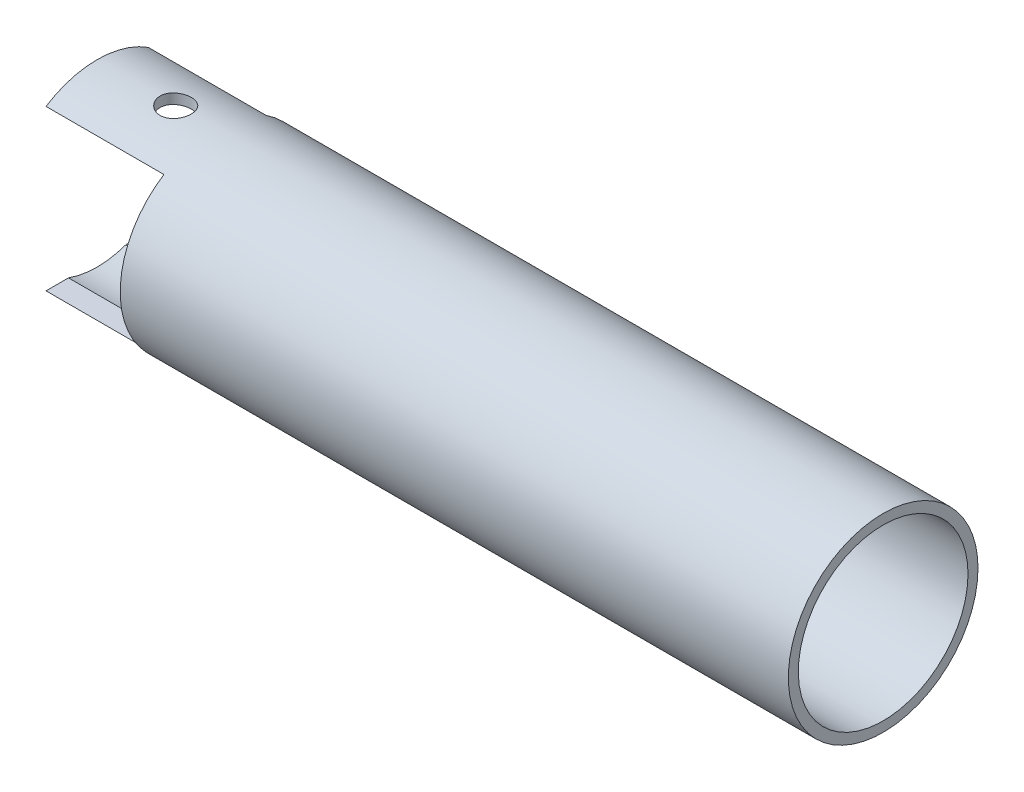
ISO-10303-21;
HEADER;
FILE_DESCRIPTION(('STEP AP214'),'2;1');
FILE_NAME('part.step','',(''),(''),'','','');
FILE_SCHEMA(('AUTOMOTIVE_DESIGN { 1 0 10303 214 1 1 1 1 }'));
ENDSEC;
DATA;
#1=APPLICATION_CONTEXT('core data for automotive mechanical design processes');
#2=APPLICATION_PROTOCOL_DEFINITION('international standard','automotive_design',2000,#1);
#3=PRODUCT_CONTEXT('',#1,'mechanical');
#4=PRODUCT('Part','Part','',(#3));
#5=PRODUCT_RELATED_PRODUCT_CATEGORY('part','',(#4));
#6=PRODUCT_DEFINITION_FORMATION('','',#4);
#7=PRODUCT_DEFINITION_CONTEXT('part definition',#1,'design');
#8=PRODUCT_DEFINITION('design','',#6,#7);
#9=PRODUCT_DEFINITION_SHAPE('','',#8);
#10=(LENGTH_UNIT() NAMED_UNIT(*) SI_UNIT(.MILLI.,.METRE.));
#11=(NAMED_UNIT(*) PLANE_ANGLE_UNIT() SI_UNIT($,.RADIAN.));
#12=(NAMED_UNIT(*) SI_UNIT($,.STERADIAN.) SOLID_ANGLE_UNIT());
#13=UNCERTAINTY_MEASURE_WITH_UNIT(LENGTH_MEASURE(1.E-05),#10,'distance_accuracy_value','');
#14=(GEOMETRIC_REPRESENTATION_CONTEXT(3) GLOBAL_UNCERTAINTY_ASSIGNED_CONTEXT((#13)) GLOBAL_UNIT_ASSIGNED_CONTEXT((#10,
#11,#12)) REPRESENTATION_CONTEXT('',''));
#15=CARTESIAN_POINT('',(0.,0.,0.));
#16=DIRECTION('',(0.,0.,1.));
#17=DIRECTION('',(1.,0.,0.));
#18=AXIS2_PLACEMENT_3D('',#15,#16,#17);
#19=CARTESIAN_POINT('',(10.,0.,0.));
#20=DIRECTION('',(-1.,0.,0.));
#21=DIRECTION('',(0.,0.,1.));
#22=AXIS2_PLACEMENT_3D('',#19,#20,#21);
#23=CYLINDRICAL_SURFACE('',#22,1.2065);
#24=CARTESIAN_POINT('',(1.,-1.19006924529363,-0.1984375));
#25=CARTESIAN_POINT('',(1.01106513792596,-1.1900694432617,-0.198437053486528));
#26=CARTESIAN_POINT('',(1.0221363707579,-1.19022524124934,-0.197508856199585));
#27=CARTESIAN_POINT('',(1.0439683482308,-1.19083105143006,-0.193822118905075));
#28=CARTESIAN_POINT('',(1.05472879455935,-1.1912813370924,-0.191061877576145));
#29=CARTESIAN_POINT('',(1.07562007442239,-1.19242377512835,-0.183796679905339));
#30=CARTESIAN_POINT('',(1.08575142022346,-1.19311572759206,-0.179293165289069));
#31=CARTESIAN_POINT('',(1.10511354807464,-1.1946632970564,-0.168672823704099));
#32=CARTESIAN_POINT('',(1.11434443439384,-1.19551889507357,-0.162556183832431));
#33=CARTESIAN_POINT('',(1.13173339663934,-1.1973065322503,-0.148820558300185));
#34=CARTESIAN_POINT('',(1.13988157155394,-1.19823916512898,-0.14118911378569));
#35=CARTESIAN_POINT('',(1.15478784336411,-1.20007051014668,-0.124667429368449));
#36=CARTESIAN_POINT('',(1.16154585871021,-1.20096922029322,-0.115777115669609));
#37=CARTESIAN_POINT('',(1.17351705185486,-1.20263773297538,-0.0969260003956265));
#38=CARTESIAN_POINT('',(1.17872102800663,-1.20340675639112,-0.0869592805700765));
#39=CARTESIAN_POINT('',(1.18737728922383,-1.20472264467824,-0.0662784032700138));
#40=CARTESIAN_POINT('',(1.19082968523951,-1.20526952362047,-0.0555642931863246));
#41=CARTESIAN_POINT('',(1.19585453880709,-1.20607531359181,-0.033795019102255));
#42=CARTESIAN_POINT('',(1.19744362484307,-1.20633677030327,-0.0227437891062657));
#43=CARTESIAN_POINT('',(1.19874844740994,-1.20655100008624,-0.000528673397395751));
#44=CARTESIAN_POINT('',(1.19846430809135,-1.20650379361481,0.0106352048006089));
#45=CARTESIAN_POINT('',(1.19604373478304,-1.20610803368625,0.0326450555078159));
#46=CARTESIAN_POINT('',(1.19392519547271,-1.20576239157834,0.0434930558443004));
#47=CARTESIAN_POINT('',(1.1879241252825,-1.20481184253152,0.0646774663163826));
#48=CARTESIAN_POINT('',(1.18404154178381,-1.20420692785892,0.0750138611813536));
#49=CARTESIAN_POINT('',(1.17460473813138,-1.20280083883769,0.0949349958775689));
#50=CARTESIAN_POINT('',(1.16904312249761,-1.20199879919693,0.104516168846337));
#51=CARTESIAN_POINT('',(1.15641154405456,-1.20028760637822,0.122616007754943));
#52=CARTESIAN_POINT('',(1.14934146228431,-1.19937844475494,0.131134589812507));
#53=CARTESIAN_POINT('',(1.13379433400619,-1.19754147643809,0.146973128926005));
#54=CARTESIAN_POINT('',(1.12530164963142,-1.1966135763702,0.154277733365217));
#55=CARTESIAN_POINT('',(1.10720314246966,-1.19485411373454,0.167360708483767));
#56=CARTESIAN_POINT('',(1.09759730992903,-1.19402255201103,0.17313906578835));
#57=CARTESIAN_POINT('',(1.07752762298207,-1.1925498807232,0.18300840873654));
#58=CARTESIAN_POINT('',(1.06706286185983,-1.19190897580987,0.187097583027306));
#59=CARTESIAN_POINT('',(1.0455821048023,-1.190893601645,0.193455799712774));
#60=CARTESIAN_POINT('',(1.03456615614309,-1.19051910958468,0.195724997925808));
#61=CARTESIAN_POINT('',(1.01243298550449,-1.1900833638426,0.198357307134749));
#62=CARTESIAN_POINT('',(1.00131843280182,-1.1900185165864,0.198742286697184));
#63=CARTESIAN_POINT('',(0.979183677394236,-1.19019983524585,0.197653472511703));
#64=CARTESIAN_POINT('',(0.968163471160058,-1.19044598947608,0.196179748601816));
#65=CARTESIAN_POINT('',(0.946599462960041,-1.1912182581859,0.191433992948938));
#66=CARTESIAN_POINT('',(0.936053151002938,-1.19174264415881,0.188173060113274));
#67=CARTESIAN_POINT('',(0.915656708896615,-1.19301084418455,0.179957079886322));
#68=CARTESIAN_POINT('',(0.905806619453152,-1.19375467105421,0.175001933538851));
#69=CARTESIAN_POINT('',(0.886984805994083,-1.1953863081272,0.16348644445238));
#70=CARTESIAN_POINT('',(0.878021776827894,-1.19627535290406,0.156912068228442));
#71=CARTESIAN_POINT('',(0.861318332878314,-1.19809362718759,0.142364037097696));
#72=CARTESIAN_POINT('',(0.853578001823756,-1.19902285944071,0.134390286442342));
#73=CARTESIAN_POINT('',(0.839459999254255,-1.20082815584409,0.117173043717969));
#74=CARTESIAN_POINT('',(0.833096899295537,-1.20170358730073,0.107917526722051));
#75=CARTESIAN_POINT('',(0.822015975140791,-1.20329253822643,0.0884561890503997));
#76=CARTESIAN_POINT('',(0.817298098807744,-1.20400606282607,0.0782503985017552));
#77=CARTESIAN_POINT('',(0.809664304013201,-1.20518805217745,0.0572218094211017));
#78=CARTESIAN_POINT('',(0.806740713538743,-1.20565755896218,0.0464018570613823));
#79=CARTESIAN_POINT('',(0.802753758799413,-1.20630301317152,0.0244162090946543));
#80=CARTESIAN_POINT('',(0.801690245642274,-1.20647898409253,0.0132505412337068));
#81=CARTESIAN_POINT('',(0.801457830088483,-1.20651722059111,-0.00896884951860625));
#82=CARTESIAN_POINT('',(0.802266739734506,-1.20638316001734,-0.0200223403028001));
#83=CARTESIAN_POINT('',(0.805708275645678,-1.20582388394589,-0.041833759306502));
#84=CARTESIAN_POINT('',(0.808340892343342,-1.20539866997566,-0.052591689076267));
#85=CARTESIAN_POINT('',(0.815346684263561,-1.20430468815428,-0.0734984601462283));
#86=CARTESIAN_POINT('',(0.819718020638856,-1.20363617767365,-0.0836479319359369));
#87=CARTESIAN_POINT('',(0.830074710378758,-1.20212864160438,-0.103072807079624));
#88=CARTESIAN_POINT('',(0.836060137009838,-1.20128960827583,-0.112348170730457));
#89=CARTESIAN_POINT('',(0.849553978794866,-1.19952227850608,-0.129873414922344));
#90=CARTESIAN_POINT('',(0.857078661000746,-1.19859308957636,-0.138110681707643));
#91=CARTESIAN_POINT('',(0.873403258246683,-1.1967564110817,-0.153213484427635));
#92=CARTESIAN_POINT('',(0.882203471576162,-1.19584892665047,-0.160078698605049));
#93=CARTESIAN_POINT('',(0.900901010836833,-1.19415167943231,-0.172285719360476));
#94=CARTESIAN_POINT('',(0.910805456776273,-1.1933627679818,-0.177616739115081));
#95=CARTESIAN_POINT('',(0.931378109803605,-1.19200203876495,-0.186531224432081));
#96=CARTESIAN_POINT('',(0.942045537389486,-1.19143000308876,-0.190116445153369));
#97=CARTESIAN_POINT('',(0.960629506510388,-1.1906953876505,-0.194654097851407));
#98=CARTESIAN_POINT('',(0.968433198396631,-1.19046188146325,-0.196070612000448));
#99=CARTESIAN_POINT('',(0.984156886548018,-1.19014874074504,-0.197962464757754));
#100=CARTESIAN_POINT('',(0.992076880789458,-1.1900691035399,-0.198437819723034));
#101=CARTESIAN_POINT('',(1.,-1.19006924529363,-0.1984375));
#102=B_SPLINE_CURVE_WITH_KNOTS('',3,(#24,#25,#26,#27,#28,#29,#30,#31,#32,#33,#34,#35,#36,#37,
#38,#39,#40,#41,#42,#43,#44,#45,#46,#47,#48,#49,#50,#51,#52,#53,#54,#55,#56,#57,#58,#59,#60,#61,
#62,#63,#64,#65,#66,#67,#68,#69,#70,#71,#72,#73,#74,#75,#76,#77,#78,#79,#80,#81,#82,#83,#84,#85,
#86,#87,#88,#89,#90,#91,#92,#93,#94,#95,#96,#97,#98,#99,#100,#101),.UNSPECIFIED.,.T.,.F.,(4,2,2,
2,2,2,2,2,2,2,2,2,2,2,2,2,2,2,2,2,2,2,2,2,2,2,2,2,2,2,2,2,2,2,2,2,2,2,4),(0.,0.0331664422313649,
0.0663637275387703,0.0995336164123578,0.132699659793797,0.16615071909359,0.199603740138323,
0.233251082358298,0.266896292989938,0.300238906206068,0.33357930961799,0.366598093423688,
0.399617862195057,0.43278524631096,0.465955247047421,0.499517192036296,0.533079431124278,
0.566677566989486,0.600272826023204,0.633477232670176,0.66668039174793,0.699679651651176,
0.732680839315465,0.765978778287351,0.799278996472766,0.832915965631343,0.866551868739893,
0.900042930693763,0.933531311690054,0.96662489460381,0.999718303904147,1.0327768067109,
1.06583681035552,1.09926614338661,1.13270330668784,1.16637012121814,1.20000301819036,
1.22375204369003,1.24750065643639),.UNSPECIFIED.);
#103=CARTESIAN_POINT('',(1.,-1.19006924529363,-0.1984375));
#104=VERTEX_POINT('',#103);
#105=EDGE_CURVE('E166',#104,#104,#102,.T.);
#106=ORIENTED_EDGE('',*,*,#105,.F.);
#107=EDGE_LOOP('',(#106));
#108=FACE_BOUND('',#107,.T.);
#109=CARTESIAN_POINT('',(0.,0.,0.));
#110=DIRECTION('',(1.,0.,0.));
#111=DIRECTION('',(0.,0.,-1.));
#112=AXIS2_PLACEMENT_3D('',#109,#110,#111);
#113=CIRCLE('',#112,1.2065);
#114=CARTESIAN_POINT('',(0.,1.016,-0.650681373638434));
#115=VERTEX_POINT('',#114);
#116=CARTESIAN_POINT('',(0.,1.016,0.650681373638434));
#117=VERTEX_POINT('',#116);
#118=EDGE_CURVE('E128',#115,#117,#113,.T.);
#119=ORIENTED_EDGE('',*,*,#118,.T.);
#120=DIRECTION('',(-1.,0.,0.));
#121=VECTOR('',#120,1.);
#122=CARTESIAN_POINT('',(10.,1.016,0.650681373638434));
#123=LINE('',#122,#121);
#124=CARTESIAN_POINT('',(1.5,1.016,0.650681373638434));
#125=VERTEX_POINT('',#124);
#126=EDGE_CURVE('E186',#117,#125,#123,.F.);
#127=ORIENTED_EDGE('',*,*,#126,.T.);
#128=CARTESIAN_POINT('',(1.5,0.,0.));
#129=DIRECTION('',(1.,0.,0.));
#130=DIRECTION('',(0.,0.,-1.));
#131=AXIS2_PLACEMENT_3D('',#128,#129,#130);
#132=CIRCLE('',#131,1.2065);
#133=CARTESIAN_POINT('',(1.5,-1.016,0.650681373638434));
#134=VERTEX_POINT('',#133);
#135=EDGE_CURVE('E111',#125,#134,#132,.T.);
#136=ORIENTED_EDGE('',*,*,#135,.T.);
#137=DIRECTION('',(-1.,0.,0.));
#138=VECTOR('',#137,1.);
#139=CARTESIAN_POINT('',(10.,-1.016,0.650681373638434));
#140=LINE('',#139,#138);
#141=CARTESIAN_POINT('',(0.,-1.016,0.650681373638434));
#142=VERTEX_POINT('',#141);
#143=EDGE_CURVE('E110',#134,#142,#140,.T.);
#144=ORIENTED_EDGE('',*,*,#143,.T.);
#145=CARTESIAN_POINT('',(0.,-1.016,-0.650681373638434));
#146=VERTEX_POINT('',#145);
#147=EDGE_CURVE('E118',#142,#146,#113,.T.);
#148=ORIENTED_EDGE('',*,*,#147,.T.);
#149=DIRECTION('',(-1.,0.,0.));
#150=VECTOR('',#149,1.);
#151=CARTESIAN_POINT('',(10.,-1.016,-0.650681373638434));
#152=LINE('',#151,#150);
#153=CARTESIAN_POINT('',(1.5,-1.016,-0.650681373638434));
#154=VERTEX_POINT('',#153);
#155=EDGE_CURVE('E102',#146,#154,#152,.F.);
#156=ORIENTED_EDGE('',*,*,#155,.T.);
#157=CARTESIAN_POINT('',(1.5,1.016,-0.650681373638434));
#158=VERTEX_POINT('',#157);
#159=EDGE_CURVE('E183',#154,#158,#132,.T.);
#160=ORIENTED_EDGE('',*,*,#159,.T.);
#161=DIRECTION('',(-1.,0.,0.));
#162=VECTOR('',#161,1.);
#163=CARTESIAN_POINT('',(10.,1.016,-0.650681373638434));
#164=LINE('',#163,#162);
#165=EDGE_CURVE('E189',#158,#115,#164,.T.);
#166=ORIENTED_EDGE('',*,*,#165,.T.);
#167=EDGE_LOOP('',(#119,#127,#136,#144,#148,#156,#160,#166));
#168=FACE_BOUND('',#167,.T.);
#169=CARTESIAN_POINT('',(10.,0.,0.));
#170=DIRECTION('',(1.,0.,0.));
#171=DIRECTION('',(0.,0.,-1.));
#172=AXIS2_PLACEMENT_3D('',#169,#170,#171);
#173=CIRCLE('',#172,1.2065);
#174=CARTESIAN_POINT('',(10.,0.,-1.2065));
#175=VERTEX_POINT('',#174);
#176=EDGE_CURVE('E131',#175,#175,#173,.T.);
#177=ORIENTED_EDGE('',*,*,#176,.F.);
#178=EDGE_LOOP('',(#177));
#179=FACE_BOUND('',#178,.T.);
#180=CARTESIAN_POINT('',(1.,1.19006924529363,-0.1984375));
#181=CARTESIAN_POINT('',(0.988934862074039,1.1900694432617,-0.198437053486528));
#182=CARTESIAN_POINT('',(0.9778636292421,1.19022524124934,-0.197508856199585));
#183=CARTESIAN_POINT('',(0.956031651769202,1.19083105143006,-0.193822118905075));
#184=CARTESIAN_POINT('',(0.945271205440649,1.1912813370924,-0.191061877576145));
#185=CARTESIAN_POINT('',(0.924379925577611,1.19242377512835,-0.183796679905339));
#186=CARTESIAN_POINT('',(0.914248579776542,1.19311572759206,-0.179293165289069));
#187=CARTESIAN_POINT('',(0.894886451925361,1.1946632970564,-0.168672823704099));
#188=CARTESIAN_POINT('',(0.885655565606163,1.19551889507357,-0.162556183832431));
#189=CARTESIAN_POINT('',(0.868266603360657,1.1973065322503,-0.148820558300185));
#190=CARTESIAN_POINT('',(0.860118428446059,1.19823916512898,-0.14118911378569));
#191=CARTESIAN_POINT('',(0.845212156635894,1.20007051014668,-0.124667429368449));
#192=CARTESIAN_POINT('',(0.838454141289791,1.20096922029322,-0.115777115669609));
#193=CARTESIAN_POINT('',(0.826482948145142,1.20263773297538,-0.0969260003956264));
#194=CARTESIAN_POINT('',(0.821278971993369,1.20340675639112,-0.0869592805700765));
#195=CARTESIAN_POINT('',(0.812622710776175,1.20472264467824,-0.0662784032700136));
#196=CARTESIAN_POINT('',(0.809170314760487,1.20526952362047,-0.0555642931863244));
#197=CARTESIAN_POINT('',(0.80414546119291,1.20607531359181,-0.0337950191022548));
#198=CARTESIAN_POINT('',(0.802556375156927,1.20633677030327,-0.0227437891062654));
#199=CARTESIAN_POINT('',(0.801251552590058,1.20655100008624,-0.000528673397395561));
#200=CARTESIAN_POINT('',(0.801535691908647,1.20650379361481,0.010635204800609));
#201=CARTESIAN_POINT('',(0.80395626521696,1.20610803368625,0.032645055507816));
#202=CARTESIAN_POINT('',(0.806074804527294,1.20576239157834,0.0434930558443006));
#203=CARTESIAN_POINT('',(0.812075874717505,1.20481184253152,0.0646774663163827));
#204=CARTESIAN_POINT('',(0.815958458216186,1.20420692785892,0.0750138611813536));
#205=CARTESIAN_POINT('',(0.825395261868623,1.20280083883769,0.0949349958775689));
#206=CARTESIAN_POINT('',(0.830956877502388,1.20199879919693,0.104516168846337));
#207=CARTESIAN_POINT('',(0.843588455945439,1.20028760637822,0.122616007754943));
#208=CARTESIAN_POINT('',(0.850658537715693,1.19937844475494,0.131134589812507));
#209=CARTESIAN_POINT('',(0.866205665993808,1.19754147643809,0.146973128926005));
#210=CARTESIAN_POINT('',(0.874698350368583,1.1966135763702,0.154277733365217));
#211=CARTESIAN_POINT('',(0.892796857530343,1.19485411373454,0.167360708483768));
#212=CARTESIAN_POINT('',(0.902402690070969,1.19402255201103,0.17313906578835));
#213=CARTESIAN_POINT('',(0.922472377017927,1.1925498807232,0.18300840873654));
#214=CARTESIAN_POINT('',(0.932937138140175,1.19190897580987,0.187097583027306));
#215=CARTESIAN_POINT('',(0.954417895197696,1.190893601645,0.193455799712775));
#216=CARTESIAN_POINT('',(0.965433843856911,1.19051910958468,0.195724997925808));
#217=CARTESIAN_POINT('',(0.987567014495513,1.1900833638426,0.198357307134749));
#218=CARTESIAN_POINT('',(0.998681567198182,1.1900185165864,0.198742286697184));
#219=CARTESIAN_POINT('',(1.02081632260576,1.19019983524585,0.197653472511703));
#220=CARTESIAN_POINT('',(1.03183652883994,1.19044598947608,0.196179748601816));
#221=CARTESIAN_POINT('',(1.05340053703996,1.1912182581859,0.191433992948938));
#222=CARTESIAN_POINT('',(1.06394684899706,1.19174264415881,0.188173060113274));
#223=CARTESIAN_POINT('',(1.08434329110339,1.19301084418455,0.179957079886322));
#224=CARTESIAN_POINT('',(1.09419338054685,1.19375467105421,0.175001933538851));
#225=CARTESIAN_POINT('',(1.11301519400592,1.1953863081272,0.16348644445238));
#226=CARTESIAN_POINT('',(1.12197822317211,1.19627535290406,0.156912068228442));
#227=CARTESIAN_POINT('',(1.13868166712169,1.19809362718759,0.142364037097696));
#228=CARTESIAN_POINT('',(1.14642199817624,1.19902285944071,0.134390286442342));
#229=CARTESIAN_POINT('',(1.16054000074575,1.20082815584409,0.117173043717969));
#230=CARTESIAN_POINT('',(1.16690310070446,1.20170358730073,0.107917526722051));
#231=CARTESIAN_POINT('',(1.17798402485921,1.20329253822643,0.0884561890503997));
#232=CARTESIAN_POINT('',(1.18270190119226,1.20400606282607,0.0782503985017553));
#233=CARTESIAN_POINT('',(1.1903356959868,1.20518805217745,0.0572218094211017));
#234=CARTESIAN_POINT('',(1.19325928646126,1.20565755896218,0.0464018570613823));
#235=CARTESIAN_POINT('',(1.19724624120059,1.20630301317152,0.0244162090946543));
#236=CARTESIAN_POINT('',(1.19830975435773,1.20647898409253,0.0132505412337069));
#237=CARTESIAN_POINT('',(1.19854216991152,1.20651722059111,-0.0089688495186061));
#238=CARTESIAN_POINT('',(1.19773326026549,1.20638316001734,-0.0200223403027999));
#239=CARTESIAN_POINT('',(1.19429172435432,1.20582388394589,-0.0418337593065018));
#240=CARTESIAN_POINT('',(1.19165910765666,1.20539866997566,-0.0525916890762669));
#241=CARTESIAN_POINT('',(1.18465331573644,1.20430468815428,-0.0734984601462282));
#242=CARTESIAN_POINT('',(1.18028197936114,1.20363617767365,-0.0836479319359369));
#243=CARTESIAN_POINT('',(1.16992528962124,1.20212864160438,-0.103072807079624));
#244=CARTESIAN_POINT('',(1.16393986299016,1.20128960827583,-0.112348170730457));
#245=CARTESIAN_POINT('',(1.15044602120513,1.19952227850608,-0.129873414922344));
#246=CARTESIAN_POINT('',(1.14292133899925,1.19859308957636,-0.138110681707643));
#247=CARTESIAN_POINT('',(1.12659674175332,1.1967564110817,-0.153213484427635));
#248=CARTESIAN_POINT('',(1.11779652842384,1.19584892665047,-0.160078698605049));
#249=CARTESIAN_POINT('',(1.09909898916317,1.19415167943231,-0.172285719360476));
#250=CARTESIAN_POINT('',(1.08919454322373,1.1933627679818,-0.177616739115081));
#251=CARTESIAN_POINT('',(1.06862189019639,1.19200203876495,-0.186531224432081));
#252=CARTESIAN_POINT('',(1.05795446261051,1.19143000308876,-0.190116445153369));
#253=CARTESIAN_POINT('',(1.03937049348961,1.1906953876505,-0.194654097851407));
#254=CARTESIAN_POINT('',(1.03156680160337,1.19046188146325,-0.196070612000448));
#255=CARTESIAN_POINT('',(1.01584311345198,1.19014874074504,-0.197962464757754));
#256=CARTESIAN_POINT('',(1.00792311921054,1.1900691035399,-0.198437819723034));
#257=CARTESIAN_POINT('',(1.,1.19006924529363,-0.1984375));
#258=B_SPLINE_CURVE_WITH_KNOTS('',3,(#180,#181,#182,#183,#184,#185,#186,#187,#188,#189,#190,
#191,#192,#193,#194,#195,#196,#197,#198,#199,#200,#201,#202,#203,#204,#205,#206,#207,#208,#209,
#210,#211,#212,#213,#214,#215,#216,#217,#218,#219,#220,#221,#222,#223,#224,#225,#226,#227,#228,
#229,#230,#231,#232,#233,#234,#235,#236,#237,#238,#239,#240,#241,#242,#243,#244,#245,#246,#247,
#248,#249,#250,#251,#252,#253,#254,#255,#256,#257),.UNSPECIFIED.,.T.,.F.,(4,2,2,2,2,2,2,2,2,2,2,
2,2,2,2,2,2,2,2,2,2,2,2,2,2,2,2,2,2,2,2,2,2,2,2,2,2,2,4),(0.,0.0331664422313648,
0.0663637275387704,0.099533616412358,0.132699659793798,0.16615071909359,0.199603740138323,
0.233251082358298,0.266896292989938,0.300238906206068,0.333579309617991,0.366598093423688,
0.399617862195057,0.43278524631096,0.465955247047421,0.499517192036296,0.533079431124278,
0.566677566989486,0.600272826023204,0.633477232670176,0.66668039174793,0.699679651651176,
0.732680839315465,0.76597877828735,0.799278996472766,0.832915965631343,0.866551868739893,
0.900042930693763,0.933531311690054,0.96662489460381,0.999718303904147,1.03277680671091,
1.06583681035552,1.09926614338661,1.13270330668784,1.16637012121814,1.20000301819036,
1.22375204369003,1.24750065643639),.UNSPECIFIED.);
#259=CARTESIAN_POINT('',(1.,1.19006924529363,-0.1984375));
#260=VERTEX_POINT('',#259);
#261=EDGE_CURVE('E170',#260,#260,#258,.T.);
#262=ORIENTED_EDGE('',*,*,#261,.F.);
#263=EDGE_LOOP('',(#262));
#264=FACE_BOUND('',#263,.T.);
#265=ADVANCED_FACE('F33',(#108,#168,#179,#264),#23,.T.);
#266=CARTESIAN_POINT('',(10.,0.,0.));
#267=DIRECTION('',(-1.,0.,0.));
#268=DIRECTION('',(0.,0.,1.));
#269=AXIS2_PLACEMENT_3D('',#266,#267,#268);
#270=CYLINDRICAL_SURFACE('',#269,1.0795);
#271=CARTESIAN_POINT('',(1.,-1.0611045229353,-0.1984375));
#272=CARTESIAN_POINT('',(1.01104481473096,-1.06110473457451,-0.198437072328947));
#273=CARTESIAN_POINT('',(1.02209522518036,-1.06127883976291,-0.197512258975323));
#274=CARTESIAN_POINT('',(1.04388473600738,-1.0619556245327,-0.193839770061529));
#275=CARTESIAN_POINT('',(1.05462355972224,-1.06245858731773,-0.191090523316015));
#276=CARTESIAN_POINT('',(1.07547145691667,-1.06373424207147,-0.183856209460972));
#277=CARTESIAN_POINT('',(1.08558109607533,-1.06450668750514,-0.179372728501783));
#278=CARTESIAN_POINT('',(1.10490396976038,-1.06623398060178,-0.168801373513006));
#279=CARTESIAN_POINT('',(1.11411727981589,-1.0671888128758,-0.162713634826711));
#280=CARTESIAN_POINT('',(1.13149697487385,-1.06918605716735,-0.149028914788437));
#281=CARTESIAN_POINT('',(1.13965107680485,-1.07022929837966,-0.141416452556752));
#282=CARTESIAN_POINT('',(1.15457393217569,-1.07227848231344,-0.124931833934172));
#283=CARTESIAN_POINT('',(1.16134259634897,-1.07328442262811,-0.11605959643576));
#284=CARTESIAN_POINT('',(1.17334933333602,-1.0751545265967,-0.0972267935633357));
#285=CARTESIAN_POINT('',(1.17857585190178,-1.07601759973191,-0.0872587442960552));
#286=CARTESIAN_POINT('',(1.18727552810504,-1.07749545262526,-0.066567564819981));
#287=CARTESIAN_POINT('',(1.19074882429399,-1.07811025200289,-0.055844494354399));
#288=CARTESIAN_POINT('',(1.19580555366107,-1.07901642991158,-0.0340748823489571));
#289=CARTESIAN_POINT('',(1.19740968192167,-1.07931134753637,-0.0230332976888541));
#290=CARTESIAN_POINT('',(1.19874699893589,-1.07955672396972,-0.00083404066748189));
#291=CARTESIAN_POINT('',(1.19848034107705,-1.07950721101846,0.010323622101532));
#292=CARTESIAN_POINT('',(1.19609957639392,-1.07907207736897,0.0322964644233327));
#293=CARTESIAN_POINT('',(1.19400775085348,-1.07869051046597,0.0431141500152434));
#294=CARTESIAN_POINT('',(1.18807124116701,-1.07763868298685,0.0642423098865377));
#295=CARTESIAN_POINT('',(1.18422649499109,-1.07696841219454,0.0745527662025019));
#296=CARTESIAN_POINT('',(1.17487188464379,-1.07540768901397,0.0944387218685129));
#297=CARTESIAN_POINT('',(1.16935306314333,-1.07451605698609,0.104009911213522));
#298=CARTESIAN_POINT('',(1.15681355401919,-1.07261130220345,0.122098698703706));
#299=CARTESIAN_POINT('',(1.14979271937931,-1.07159816756034,0.130616193584972));
#300=CARTESIAN_POINT('',(1.13432554763122,-1.06954508207853,0.146487761453558));
#301=CARTESIAN_POINT('',(1.12585972031825,-1.0685049560997,0.15382283073324));
#302=CARTESIAN_POINT('',(1.10780793878197,-1.06652942520784,0.166971793155047));
#303=CARTESIAN_POINT('',(1.09822196940398,-1.06559402171195,0.172785665713068));
#304=CARTESIAN_POINT('',(1.07817740338255,-1.06393361917592,0.182732304524363));
#305=CARTESIAN_POINT('',(1.06771745031736,-1.06320895531552,0.186862396885516));
#306=CARTESIAN_POINT('',(1.04623581231617,-1.06205728228612,0.193301277821835));
#307=CARTESIAN_POINT('',(1.03521418850846,-1.06163024079992,0.195610264144618));
#308=CARTESIAN_POINT('',(1.01309319156443,-1.06112853278087,0.198313826111014));
#309=CARTESIAN_POINT('',(1.00199726087754,-1.06104884848975,0.19873566495846));
#310=CARTESIAN_POINT('',(0.979893483262387,-1.06123746110168,0.197725960521443));
#311=CARTESIAN_POINT('',(0.968885632181108,-1.06150574149947,0.196294505145589));
#312=CARTESIAN_POINT('',(0.947359554577657,-1.06235538803625,0.191642221859055));
#313=CARTESIAN_POINT('',(0.936838148751891,-1.06293426579349,0.18843560939848));
#314=CARTESIAN_POINT('',(0.916481964645299,-1.0643377486992,0.180339086716018));
#315=CARTESIAN_POINT('',(0.906647235309053,-1.06516237134172,0.175449056651362));
#316=CARTESIAN_POINT('',(0.887823241460631,-1.06697589944824,0.164061466813776));
#317=CARTESIAN_POINT('',(0.878844592795668,-1.06796652951813,0.157546638560455));
#318=CARTESIAN_POINT('',(0.862098090753065,-1.06999556734201,0.143117746462905));
#319=CARTESIAN_POINT('',(0.854330341936095,-1.07103397921192,0.135203561910665));
#320=CARTESIAN_POINT('',(0.840124708148783,-1.07305765585471,0.118079024885561));
#321=CARTESIAN_POINT('',(0.833705130730507,-1.07404206955276,0.108853369091631));
#322=CARTESIAN_POINT('',(0.822507094382086,-1.07583264042053,0.0894386667146396));
#323=CARTESIAN_POINT('',(0.817728574015725,-1.076638804263,0.0792496562148822));
#324=CARTESIAN_POINT('',(0.80997590377263,-1.0779783753601,0.0582487553003752));
#325=CARTESIAN_POINT('',(0.80699265494425,-1.07851315586191,0.047440315264722));
#326=CARTESIAN_POINT('',(0.802886120753583,-1.07925555371944,0.0254650753427441));
#327=CARTESIAN_POINT('',(0.801762647618297,-1.07946320410389,0.0142983117507675));
#328=CARTESIAN_POINT('',(0.801413884959641,-1.07952732346826,-0.00790081734926416));
#329=CARTESIAN_POINT('',(0.802160907801975,-1.07938891495869,-0.0189327426627827));
#330=CARTESIAN_POINT('',(0.805471430570878,-1.07878707792745,-0.0407110645120802));
#331=CARTESIAN_POINT('',(0.808034914518873,-1.0783236522648,-0.05145746355864));
#332=CARTESIAN_POINT('',(0.814894111256091,-1.07712380793391,-0.0723457928154645));
#333=CARTESIAN_POINT('',(0.819186985259098,-1.07638783680696,-0.0824886825194599));
#334=CARTESIAN_POINT('',(0.829379831231755,-1.07472269426712,-0.101914362890539));
#335=CARTESIAN_POINT('',(0.835279905231808,-1.07379351058934,-0.111197098902047));
#336=CARTESIAN_POINT('',(0.848615505599484,-1.07182839008755,-0.128777227170307));
#337=CARTESIAN_POINT('',(0.856071087587202,-1.07079115761552,-0.137059262934667));
#338=CARTESIAN_POINT('',(0.872264348762581,-1.06873516136022,-0.152264311087932));
#339=CARTESIAN_POINT('',(0.881002328679035,-1.06771640197212,-0.159187003811329));
#340=CARTESIAN_POINT('',(0.899604625413767,-1.06580288268808,-0.171534128106374));
#341=CARTESIAN_POINT('',(0.909478213256832,-1.06490929812689,-0.176944779005257));
#342=CARTESIAN_POINT('',(0.930007312888986,-1.06336139211265,-0.186021982100036));
#343=CARTESIAN_POINT('',(0.940662067310432,-1.06270684249615,-0.189690198494383));
#344=CARTESIAN_POINT('',(0.959458519831366,-1.06184921849176,-0.19442336483651));
#345=CARTESIAN_POINT('',(0.967489428049436,-1.06157159620107,-0.195926116715818));
#346=CARTESIAN_POINT('',(0.983679207748174,-1.06119917254313,-0.197933329654748));
#347=CARTESIAN_POINT('',(0.991838075977071,-1.06110436653764,-0.198437816041394));
#348=CARTESIAN_POINT('',(1.,-1.0611045229353,-0.1984375));
#349=B_SPLINE_CURVE_WITH_KNOTS('',3,(#271,#272,#273,#274,#275,#276,#277,#278,#279,#280,#281,
#282,#283,#284,#285,#286,#287,#288,#289,#290,#291,#292,#293,#294,#295,#296,#297,#298,#299,#300,
#301,#302,#303,#304,#305,#306,#307,#308,#309,#310,#311,#312,#313,#314,#315,#316,#317,#318,#319,
#320,#321,#322,#323,#324,#325,#326,#327,#328,#329,#330,#331,#332,#333,#334,#335,#336,#337,#338,
#339,#340,#341,#342,#343,#344,#345,#346,#347,#348),.UNSPECIFIED.,.T.,.F.,(4,2,2,2,2,2,2,2,2,2,2,
2,2,2,2,2,2,2,2,2,2,2,2,2,2,2,2,2,2,2,2,2,2,2,2,2,2,2,4),(0.,0.0331045797245994,
0.0662377058721914,0.0993405994681236,0.132440701230147,0.165895669490549,0.19935279264386,
0.233054568140607,0.266753679878399,0.300076025325883,0.333395638674507,0.366314095684071,
0.399233717655958,0.432332683315051,0.465434890165576,0.499025124012875,0.532615812363566,
0.566259637851406,0.599899809569242,0.63305238610503,0.666203390148933,0.69909268293555,
0.731984317600541,0.765241650706209,0.798501853979164,0.832188062564186,0.865873009901859,
0.899385762003084,0.932895130269425,0.96591142382211,0.998927426949207,1.03188945385631,
1.06485357379045,1.09827235813098,1.13169899190475,1.16542101535833,1.19911076583703,
1.22357508928155,1.24803879203301),.UNSPECIFIED.);
#350=CARTESIAN_POINT('',(1.,-1.0611045229353,-0.1984375));
#351=VERTEX_POINT('',#350);
#352=EDGE_CURVE('E145',#351,#351,#349,.T.);
#353=ORIENTED_EDGE('',*,*,#352,.T.);
#354=EDGE_LOOP('',(#353));
#355=FACE_BOUND('',#354,.T.);
#356=DIRECTION('',(-1.,0.,0.));
#357=VECTOR('',#356,1.);
#358=CARTESIAN_POINT('',(10.,1.016,0.364779728055165));
#359=LINE('',#358,#357);
#360=CARTESIAN_POINT('',(0.,1.016,0.364779728055165));
#361=VERTEX_POINT('',#360);
#362=CARTESIAN_POINT('',(1.5,1.016,0.364779728055165));
#363=VERTEX_POINT('',#362);
#364=EDGE_CURVE('E11',#361,#363,#359,.F.);
#365=ORIENTED_EDGE('',*,*,#364,.F.);
#366=CARTESIAN_POINT('',(0.,0.,0.));
#367=DIRECTION('',(1.,0.,0.));
#368=DIRECTION('',(0.,0.,-1.));
#369=AXIS2_PLACEMENT_3D('',#366,#367,#368);
#370=CIRCLE('',#369,1.0795);
#371=CARTESIAN_POINT('',(0.,1.016,-0.364779728055165));
#372=VERTEX_POINT('',#371);
#373=EDGE_CURVE('E133',#372,#361,#370,.T.);
#374=ORIENTED_EDGE('',*,*,#373,.F.);
#375=DIRECTION('',(-1.,0.,0.));
#376=VECTOR('',#375,1.);
#377=CARTESIAN_POINT('',(10.,1.016,-0.364779728055165));
#378=LINE('',#377,#376);
#379=CARTESIAN_POINT('',(1.5,1.016,-0.364779728055165));
#380=VERTEX_POINT('',#379);
#381=EDGE_CURVE('E143',#380,#372,#378,.T.);
#382=ORIENTED_EDGE('',*,*,#381,.F.);
#383=CARTESIAN_POINT('',(1.5,0.,0.));
#384=DIRECTION('',(1.,0.,0.));
#385=DIRECTION('',(0.,0.,-1.));
#386=AXIS2_PLACEMENT_3D('',#383,#384,#385);
#387=CIRCLE('',#386,1.0795);
#388=CARTESIAN_POINT('',(1.5,-1.016,-0.364779728055165));
#389=VERTEX_POINT('',#388);
#390=EDGE_CURVE('E138',#389,#380,#387,.T.);
#391=ORIENTED_EDGE('',*,*,#390,.F.);
#392=DIRECTION('',(-1.,0.,0.));
#393=VECTOR('',#392,1.);
#394=CARTESIAN_POINT('',(10.,-1.016,-0.364779728055165));
#395=LINE('',#394,#393);
#396=CARTESIAN_POINT('',(0.,-1.016,-0.364779728055165));
#397=VERTEX_POINT('',#396);
#398=EDGE_CURVE('E140',#397,#389,#395,.F.);
#399=ORIENTED_EDGE('',*,*,#398,.F.);
#400=CARTESIAN_POINT('',(0.,-1.016,0.364779728055165));
#401=VERTEX_POINT('',#400);
#402=EDGE_CURVE('E120',#401,#397,#370,.T.);
#403=ORIENTED_EDGE('',*,*,#402,.F.);
#404=DIRECTION('',(-1.,0.,0.));
#405=VECTOR('',#404,1.);
#406=CARTESIAN_POINT('',(10.,-1.016,0.364779728055165));
#407=LINE('',#406,#405);
#408=CARTESIAN_POINT('',(1.5,-1.016,0.364779728055165));
#409=VERTEX_POINT('',#408);
#410=EDGE_CURVE('E46',#409,#401,#407,.T.);
#411=ORIENTED_EDGE('',*,*,#410,.F.);
#412=EDGE_CURVE('E141',#363,#409,#387,.T.);
#413=ORIENTED_EDGE('',*,*,#412,.F.);
#414=EDGE_LOOP('',(#365,#374,#382,#391,#399,#403,#411,#413));
#415=FACE_BOUND('',#414,.T.);
#416=CARTESIAN_POINT('',(10.,0.,0.));
#417=DIRECTION('',(1.,0.,0.));
#418=DIRECTION('',(0.,0.,-1.));
#419=AXIS2_PLACEMENT_3D('',#416,#417,#418);
#420=CIRCLE('',#419,1.0795);
#421=CARTESIAN_POINT('',(10.,0.,-1.0795));
#422=VERTEX_POINT('',#421);
#423=EDGE_CURVE('E129',#422,#422,#420,.T.);
#424=ORIENTED_EDGE('',*,*,#423,.T.);
#425=EDGE_LOOP('',(#424));
#426=FACE_BOUND('',#425,.T.);
#427=CARTESIAN_POINT('',(1.,1.0611045229353,-0.1984375));
#428=CARTESIAN_POINT('',(0.988955185269037,1.06110473457451,-0.198437072328947));
#429=CARTESIAN_POINT('',(0.977904774819638,1.06127883976291,-0.197512258975323));
#430=CARTESIAN_POINT('',(0.956115263992619,1.0619556245327,-0.193839770061529));
#431=CARTESIAN_POINT('',(0.945376440277763,1.06245858731773,-0.191090523316015));
#432=CARTESIAN_POINT('',(0.924528543083328,1.06373424207147,-0.183856209460972));
#433=CARTESIAN_POINT('',(0.914418903924667,1.06450668750514,-0.179372728501783));
#434=CARTESIAN_POINT('',(0.89509603023962,1.06623398060178,-0.168801373513006));
#435=CARTESIAN_POINT('',(0.885882720184112,1.0671888128758,-0.162713634826711));
#436=CARTESIAN_POINT('',(0.868503025126153,1.06918605716735,-0.149028914788437));
#437=CARTESIAN_POINT('',(0.860348923195146,1.07022929837966,-0.141416452556752));
#438=CARTESIAN_POINT('',(0.845426067824311,1.07227848231344,-0.124931833934172));
#439=CARTESIAN_POINT('',(0.838657403651029,1.07328442262811,-0.11605959643576));
#440=CARTESIAN_POINT('',(0.826650666663982,1.0751545265967,-0.0972267935633357));
#441=CARTESIAN_POINT('',(0.821424148098216,1.07601759973191,-0.0872587442960551));
#442=CARTESIAN_POINT('',(0.812724471894963,1.07749545262526,-0.066567564819981));
#443=CARTESIAN_POINT('',(0.809251175706007,1.07811025200289,-0.0558444943543991));
#444=CARTESIAN_POINT('',(0.804194446338933,1.07901642991158,-0.0340748823489571));
#445=CARTESIAN_POINT('',(0.802590318078333,1.07931134753637,-0.0230332976888541));
#446=CARTESIAN_POINT('',(0.801253001064109,1.07955672396972,-0.000834040667481903));
#447=CARTESIAN_POINT('',(0.801519658922952,1.07950721101846,0.0103236221015321));
#448=CARTESIAN_POINT('',(0.803900423606076,1.07907207736897,0.0322964644233328));
#449=CARTESIAN_POINT('',(0.805992249146519,1.07869051046597,0.0431141500152434));
#450=CARTESIAN_POINT('',(0.811928758832995,1.07763868298685,0.0642423098865377));
#451=CARTESIAN_POINT('',(0.81577350500891,1.07696841219454,0.0745527662025019));
#452=CARTESIAN_POINT('',(0.825128115356214,1.07540768901397,0.0944387218685129));
#453=CARTESIAN_POINT('',(0.830646936856673,1.07451605698609,0.104009911213522));
#454=CARTESIAN_POINT('',(0.843186445980814,1.07261130220345,0.122098698703706));
#455=CARTESIAN_POINT('',(0.850207280620691,1.07159816756034,0.130616193584971));
#456=CARTESIAN_POINT('',(0.865674452368783,1.06954508207853,0.146487761453558));
#457=CARTESIAN_POINT('',(0.874140279681754,1.0685049560997,0.15382283073324));
#458=CARTESIAN_POINT('',(0.89219206121803,1.06652942520784,0.166971793155047));
#459=CARTESIAN_POINT('',(0.901778030596021,1.06559402171195,0.172785665713068));
#460=CARTESIAN_POINT('',(0.921822596617447,1.06393361917592,0.182732304524363));
#461=CARTESIAN_POINT('',(0.932282549682635,1.06320895531552,0.186862396885515));
#462=CARTESIAN_POINT('',(0.953764187683827,1.06205728228612,0.193301277821835));
#463=CARTESIAN_POINT('',(0.964785811491539,1.06163024079992,0.195610264144618));
#464=CARTESIAN_POINT('',(0.98690680843557,1.06112853278087,0.198313826111014));
#465=CARTESIAN_POINT('',(0.998002739122463,1.06104884848975,0.19873566495846));
#466=CARTESIAN_POINT('',(1.02010651673761,1.06123746110168,0.197725960521443));
#467=CARTESIAN_POINT('',(1.03111436781889,1.06150574149947,0.196294505145589));
#468=CARTESIAN_POINT('',(1.05264044542234,1.06235538803625,0.191642221859055));
#469=CARTESIAN_POINT('',(1.06316185124811,1.06293426579349,0.18843560939848));
#470=CARTESIAN_POINT('',(1.0835180353547,1.0643377486992,0.180339086716018));
#471=CARTESIAN_POINT('',(1.09335276469095,1.06516237134172,0.175449056651362));
#472=CARTESIAN_POINT('',(1.11217675853937,1.06697589944824,0.164061466813776));
#473=CARTESIAN_POINT('',(1.12115540720433,1.06796652951813,0.157546638560455));
#474=CARTESIAN_POINT('',(1.13790190924694,1.06999556734201,0.143117746462905));
#475=CARTESIAN_POINT('',(1.1456696580639,1.07103397921192,0.135203561910665));
#476=CARTESIAN_POINT('',(1.15987529185122,1.07305765585471,0.118079024885561));
#477=CARTESIAN_POINT('',(1.16629486926949,1.07404206955276,0.108853369091631));
#478=CARTESIAN_POINT('',(1.17749290561791,1.07583264042053,0.0894386667146397));
#479=CARTESIAN_POINT('',(1.18227142598428,1.076638804263,0.0792496562148823));
#480=CARTESIAN_POINT('',(1.19002409622737,1.0779783753601,0.0582487553003753));
#481=CARTESIAN_POINT('',(1.19300734505575,1.07851315586191,0.0474403152647221));
#482=CARTESIAN_POINT('',(1.19711387924642,1.07925555371944,0.0254650753427441));
#483=CARTESIAN_POINT('',(1.1982373523817,1.07946320410389,0.0142983117507676));
#484=CARTESIAN_POINT('',(1.19858611504036,1.07952732346826,-0.00790081734926408));
#485=CARTESIAN_POINT('',(1.19783909219802,1.07938891495869,-0.0189327426627826));
#486=CARTESIAN_POINT('',(1.19452856942912,1.07878707792745,-0.0407110645120801));
#487=CARTESIAN_POINT('',(1.19196508548113,1.0783236522648,-0.0514574635586399));
#488=CARTESIAN_POINT('',(1.18510588874391,1.07712380793391,-0.0723457928154644));
#489=CARTESIAN_POINT('',(1.1808130147409,1.07638783680696,-0.0824886825194599));
#490=CARTESIAN_POINT('',(1.17062016876825,1.07472269426712,-0.101914362890539));
#491=CARTESIAN_POINT('',(1.16472009476819,1.07379351058934,-0.111197098902047));
#492=CARTESIAN_POINT('',(1.15138449440052,1.07182839008755,-0.128777227170307));
#493=CARTESIAN_POINT('',(1.1439289124128,1.07079115761552,-0.137059262934667));
#494=CARTESIAN_POINT('',(1.12773565123742,1.06873516136022,-0.152264311087932));
#495=CARTESIAN_POINT('',(1.11899767132096,1.06771640197212,-0.159187003811329));
#496=CARTESIAN_POINT('',(1.10039537458623,1.06580288268808,-0.171534128106374));
#497=CARTESIAN_POINT('',(1.09052178674317,1.06490929812689,-0.176944779005257));
#498=CARTESIAN_POINT('',(1.06999268711101,1.06336139211265,-0.186021982100036));
#499=CARTESIAN_POINT('',(1.05933793268957,1.06270684249615,-0.189690198494383));
#500=CARTESIAN_POINT('',(1.04054148016863,1.06184921849176,-0.19442336483651));
#501=CARTESIAN_POINT('',(1.03251057195056,1.06157159620107,-0.195926116715818));
#502=CARTESIAN_POINT('',(1.01632079225183,1.06119917254313,-0.197933329654748));
#503=CARTESIAN_POINT('',(1.00816192402293,1.06110436653764,-0.198437816041394));
#504=CARTESIAN_POINT('',(1.,1.0611045229353,-0.1984375));
#505=B_SPLINE_CURVE_WITH_KNOTS('',3,(#427,#428,#429,#430,#431,#432,#433,#434,#435,#436,#437,
#438,#439,#440,#441,#442,#443,#444,#445,#446,#447,#448,#449,#450,#451,#452,#453,#454,#455,#456,
#457,#458,#459,#460,#461,#462,#463,#464,#465,#466,#467,#468,#469,#470,#471,#472,#473,#474,#475,
#476,#477,#478,#479,#480,#481,#482,#483,#484,#485,#486,#487,#488,#489,#490,#491,#492,#493,#494,
#495,#496,#497,#498,#499,#500,#501,#502,#503,#504),.UNSPECIFIED.,.T.,.F.,(4,2,2,2,2,2,2,2,2,2,2,
2,2,2,2,2,2,2,2,2,2,2,2,2,2,2,2,2,2,2,2,2,2,2,2,2,2,2,4),(0.,0.0331045797245993,
0.0662377058721914,0.0993405994681238,0.132440701230147,0.165895669490549,0.19935279264386,
0.233054568140607,0.266753679878399,0.300076025325883,0.333395638674507,0.366314095684071,
0.399233717655957,0.43233268331505,0.465434890165576,0.499025124012875,0.532615812363566,
0.566259637851405,0.599899809569242,0.63305238610503,0.666203390148933,0.69909268293555,
0.731984317600541,0.765241650706209,0.798501853979164,0.832188062564186,0.865873009901859,
0.899385762003084,0.932895130269425,0.96591142382211,0.998927426949207,1.03188945385631,
1.06485357379045,1.09827235813098,1.13169899190475,1.16542101535833,1.19911076583703,
1.22357508928155,1.24803879203301),.UNSPECIFIED.);
#506=CARTESIAN_POINT('',(1.,1.0611045229353,-0.1984375));
#507=VERTEX_POINT('',#506);
#508=EDGE_CURVE('E37',#507,#507,#505,.T.);
#509=ORIENTED_EDGE('',*,*,#508,.T.);
#510=EDGE_LOOP('',(#509));
#511=FACE_BOUND('',#510,.T.);
#512=ADVANCED_FACE('F149',(#355,#415,#426,#511),#270,.F.);
#513=CARTESIAN_POINT('',(0.,0.,0.));
#514=DIRECTION('',(1.,0.,0.));
#515=DIRECTION('',(0.,0.,-1.));
#516=AXIS2_PLACEMENT_3D('',#513,#514,#515);
#517=PLANE('',#516);
#518=ORIENTED_EDGE('',*,*,#118,.F.);
#519=DIRECTION('',(0.,0.,-1.));
#520=VECTOR('',#519,1.);
#521=CARTESIAN_POINT('',(0.,1.016,-2.19761266826168));
#522=LINE('',#521,#520);
#523=EDGE_CURVE('E121',#372,#115,#522,.T.);
#524=ORIENTED_EDGE('',*,*,#523,.F.);
#525=ORIENTED_EDGE('',*,*,#373,.T.);
#526=EDGE_CURVE('E178',#117,#361,#522,.T.);
#527=ORIENTED_EDGE('',*,*,#526,.F.);
#528=EDGE_LOOP('',(#518,#524,#525,#527));
#529=FACE_BOUND('',#528,.T.);
#530=ADVANCED_FACE('F197',(#529),#517,.F.);
#531=CARTESIAN_POINT('',(10.,0.,0.));
#532=DIRECTION('',(1.,0.,0.));
#533=DIRECTION('',(0.,0.,-1.));
#534=AXIS2_PLACEMENT_3D('',#531,#532,#533);
#535=PLANE('',#534);
#536=ORIENTED_EDGE('',*,*,#176,.T.);
#537=EDGE_LOOP('',(#536));
#538=FACE_BOUND('',#537,.T.);
#539=ORIENTED_EDGE('',*,*,#423,.F.);
#540=EDGE_LOOP('',(#539));
#541=FACE_BOUND('',#540,.T.);
#542=ADVANCED_FACE('F232',(#538,#541),#535,.T.);
#543=ORIENTED_EDGE('',*,*,#147,.F.);
#544=DIRECTION('',(0.,0.,1.));
#545=VECTOR('',#544,1.);
#546=CARTESIAN_POINT('',(0.,-1.016,-2.19761266826168));
#547=LINE('',#546,#545);
#548=EDGE_CURVE('E122',#401,#142,#547,.T.);
#549=ORIENTED_EDGE('',*,*,#548,.F.);
#550=ORIENTED_EDGE('',*,*,#402,.T.);
#551=EDGE_CURVE('E105',#146,#397,#547,.T.);
#552=ORIENTED_EDGE('',*,*,#551,.F.);
#553=EDGE_LOOP('',(#543,#549,#550,#552));
#554=FACE_BOUND('',#553,.T.);
#555=ADVANCED_FACE('F116',(#554),#517,.F.);
#556=CARTESIAN_POINT('',(1.5,0.,0.));
#557=DIRECTION('',(1.,0.,0.));
#558=DIRECTION('',(0.,0.,-1.));
#559=AXIS2_PLACEMENT_3D('',#556,#557,#558);
#560=PLANE('',#559);
#561=DIRECTION('',(0.,0.,1.));
#562=VECTOR('',#561,1.);
#563=CARTESIAN_POINT('',(1.5,-1.016,-2.19761266826168));
#564=LINE('',#563,#562);
#565=EDGE_CURVE('E61',#154,#389,#564,.T.);
#566=ORIENTED_EDGE('',*,*,#565,.T.);
#567=ORIENTED_EDGE('',*,*,#390,.T.);
#568=DIRECTION('',(0.,0.,-1.));
#569=VECTOR('',#568,1.);
#570=CARTESIAN_POINT('',(1.5,1.016,-2.19761266826168));
#571=LINE('',#570,#569);
#572=EDGE_CURVE('E179',#380,#158,#571,.T.);
#573=ORIENTED_EDGE('',*,*,#572,.T.);
#574=ORIENTED_EDGE('',*,*,#159,.F.);
#575=EDGE_LOOP('',(#566,#567,#573,#574));
#576=FACE_BOUND('',#575,.T.);
#577=ADVANCED_FACE('F210',(#576),#560,.F.);
#578=CARTESIAN_POINT('',(1.5,-1.016,-2.19761266826168));
#579=DIRECTION('',(0.,-1.,0.));
#580=DIRECTION('',(0.,0.,-1.));
#581=AXIS2_PLACEMENT_3D('',#578,#579,#580);
#582=PLANE('',#581);
#583=ORIENTED_EDGE('',*,*,#551,.T.);
#584=ORIENTED_EDGE('',*,*,#398,.T.);
#585=ORIENTED_EDGE('',*,*,#565,.F.);
#586=ORIENTED_EDGE('',*,*,#155,.F.);
#587=EDGE_LOOP('',(#583,#584,#585,#586));
#588=FACE_BOUND('',#587,.T.);
#589=ADVANCED_FACE('F104',(#588),#582,.F.);
#590=CARTESIAN_POINT('',(1.5,1.016,-2.19761266826168));
#591=DIRECTION('',(0.,1.,0.));
#592=DIRECTION('',(0.,0.,1.));
#593=AXIS2_PLACEMENT_3D('',#590,#591,#592);
#594=PLANE('',#593);
#595=ORIENTED_EDGE('',*,*,#572,.F.);
#596=ORIENTED_EDGE('',*,*,#381,.T.);
#597=ORIENTED_EDGE('',*,*,#523,.T.);
#598=ORIENTED_EDGE('',*,*,#165,.F.);
#599=EDGE_LOOP('',(#595,#596,#597,#598));
#600=FACE_BOUND('',#599,.T.);
#601=ADVANCED_FACE('F209',(#600),#594,.F.);
#602=ORIENTED_EDGE('',*,*,#526,.T.);
#603=ORIENTED_EDGE('',*,*,#364,.T.);
#604=EDGE_CURVE('E54',#125,#363,#571,.T.);
#605=ORIENTED_EDGE('',*,*,#604,.F.);
#606=ORIENTED_EDGE('',*,*,#126,.F.);
#607=EDGE_LOOP('',(#602,#603,#605,#606));
#608=FACE_BOUND('',#607,.T.);
#609=ADVANCED_FACE('F206',(#608),#594,.F.);
#610=EDGE_CURVE('E175',#409,#134,#564,.T.);
#611=ORIENTED_EDGE('',*,*,#610,.F.);
#612=ORIENTED_EDGE('',*,*,#410,.T.);
#613=ORIENTED_EDGE('',*,*,#548,.T.);
#614=ORIENTED_EDGE('',*,*,#143,.F.);
#615=EDGE_LOOP('',(#611,#612,#613,#614));
#616=FACE_BOUND('',#615,.T.);
#617=ADVANCED_FACE('F213',(#616),#582,.F.);
#618=ORIENTED_EDGE('',*,*,#604,.T.);
#619=ORIENTED_EDGE('',*,*,#412,.T.);
#620=ORIENTED_EDGE('',*,*,#610,.T.);
#621=ORIENTED_EDGE('',*,*,#135,.F.);
#622=EDGE_LOOP('',(#618,#619,#620,#621));
#623=FACE_BOUND('',#622,.T.);
#624=ADVANCED_FACE('F159',(#623),#560,.F.);
#625=CARTESIAN_POINT('',(1.,5.,0.));
#626=DIRECTION('',(0.,-1.,0.));
#627=DIRECTION('',(0.,0.,-1.));
#628=AXIS2_PLACEMENT_3D('',#625,#626,#627);
#629=CYLINDRICAL_SURFACE('',#628,0.1984375);
#630=ORIENTED_EDGE('',*,*,#352,.F.);
#631=EDGE_LOOP('',(#630));
#632=FACE_BOUND('',#631,.T.);
#633=ORIENTED_EDGE('',*,*,#105,.T.);
#634=EDGE_LOOP('',(#633));
#635=FACE_BOUND('',#634,.T.);
#636=ADVANCED_FACE('F157',(#632,#635),#629,.F.);
#637=ORIENTED_EDGE('',*,*,#508,.F.);
#638=EDGE_LOOP('',(#637));
#639=FACE_BOUND('',#638,.T.);
#640=ORIENTED_EDGE('',*,*,#261,.T.);
#641=EDGE_LOOP('',(#640));
#642=FACE_BOUND('',#641,.T.);
#643=ADVANCED_FACE('F153',(#639,#642),#629,.F.);
#644=CLOSED_SHELL('',(#265,#512,#530,#542,#555,#577,#589,#601,#609,#617,#624,#636,#643));
#645=MANIFOLD_SOLID_BREP('B2',#644);
#646=ADVANCED_BREP_SHAPE_REPRESENTATION('',(#18,#645),#14);
#647=SHAPE_DEFINITION_REPRESENTATION(#9,#646);
ENDSEC;
END-ISO-10303-21;
